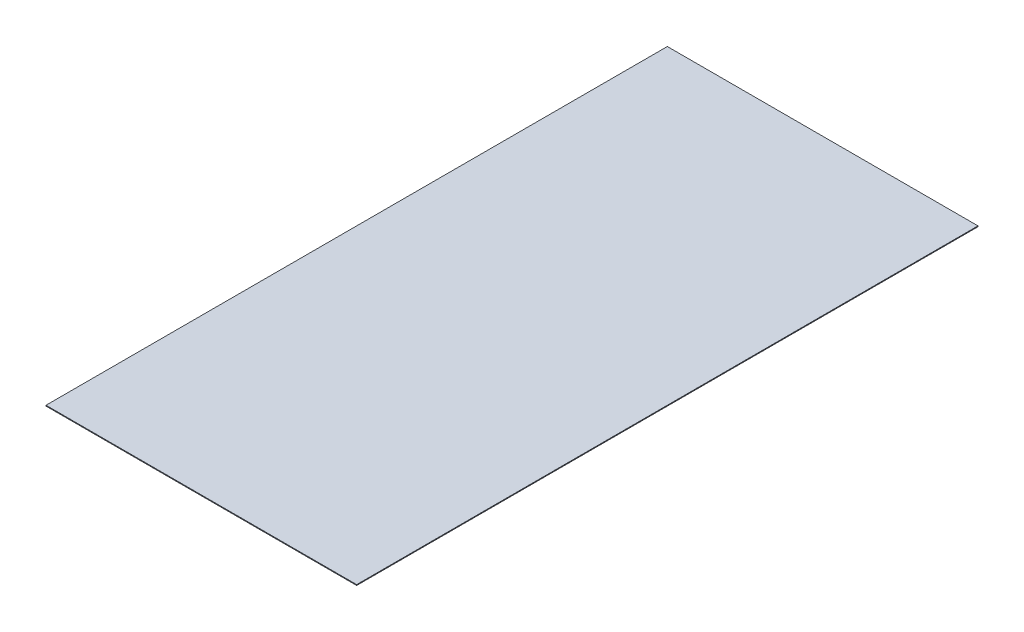
ISO-10303-21;
HEADER;
FILE_DESCRIPTION(('STEP AP214'),'2;1');
FILE_NAME('part.step','',(''),(''),'','','');
FILE_SCHEMA(('AUTOMOTIVE_DESIGN { 1 0 10303 214 1 1 1 1 }'));
ENDSEC;
DATA;
#1=APPLICATION_CONTEXT('core data for automotive mechanical design processes');
#2=APPLICATION_PROTOCOL_DEFINITION('international standard','automotive_design',2000,#1);
#3=PRODUCT_CONTEXT('',#1,'mechanical');
#4=PRODUCT('Part','Part','',(#3));
#5=PRODUCT_RELATED_PRODUCT_CATEGORY('part','',(#4));
#6=PRODUCT_DEFINITION_FORMATION('','',#4);
#7=PRODUCT_DEFINITION_CONTEXT('part definition',#1,'design');
#8=PRODUCT_DEFINITION('design','',#6,#7);
#9=PRODUCT_DEFINITION_SHAPE('','',#8);
#10=(LENGTH_UNIT() NAMED_UNIT(*) SI_UNIT(.MILLI.,.METRE.));
#11=(NAMED_UNIT(*) PLANE_ANGLE_UNIT() SI_UNIT($,.RADIAN.));
#12=(NAMED_UNIT(*) SI_UNIT($,.STERADIAN.) SOLID_ANGLE_UNIT());
#13=UNCERTAINTY_MEASURE_WITH_UNIT(LENGTH_MEASURE(1.E-05),#10,'distance_accuracy_value','');
#14=(GEOMETRIC_REPRESENTATION_CONTEXT(3) GLOBAL_UNCERTAINTY_ASSIGNED_CONTEXT((#13)) GLOBAL_UNIT_ASSIGNED_CONTEXT((#10,
#11,#12)) REPRESENTATION_CONTEXT('',''));
#15=CARTESIAN_POINT('',(0.,0.,0.));
#16=DIRECTION('',(0.,0.,1.));
#17=DIRECTION('',(1.,0.,0.));
#18=AXIS2_PLACEMENT_3D('',#15,#16,#17);
#19=CARTESIAN_POINT('',(0.,1.,0.));
#20=DIRECTION('',(1.,0.,0.));
#21=DIRECTION('',(0.,0.,-1.));
#22=AXIS2_PLACEMENT_3D('',#19,#20,#21);
#23=PLANE('',#22);
#24=DIRECTION('',(0.,0.,1.));
#25=VECTOR('',#24,1.);
#26=CARTESIAN_POINT('',(0.,0.,0.));
#27=LINE('',#26,#25);
#28=CARTESIAN_POINT('',(0.,0.,-800.));
#29=VERTEX_POINT('',#28);
#30=CARTESIAN_POINT('',(0.,0.,0.));
#31=VERTEX_POINT('',#30);
#32=EDGE_CURVE('E109',#29,#31,#27,.T.);
#33=ORIENTED_EDGE('',*,*,#32,.T.);
#34=DIRECTION('',(0.,-1.,0.));
#35=VECTOR('',#34,1.);
#36=CARTESIAN_POINT('',(0.,1.,0.));
#37=LINE('',#36,#35);
#38=CARTESIAN_POINT('',(0.,1.,0.));
#39=VERTEX_POINT('',#38);
#40=EDGE_CURVE('E11',#39,#31,#37,.T.);
#41=ORIENTED_EDGE('',*,*,#40,.F.);
#42=DIRECTION('',(0.,0.,1.));
#43=VECTOR('',#42,1.);
#44=CARTESIAN_POINT('',(0.,1.,0.));
#45=LINE('',#44,#43);
#46=CARTESIAN_POINT('',(0.,1.,-800.));
#47=VERTEX_POINT('',#46);
#48=EDGE_CURVE('E93',#47,#39,#45,.T.);
#49=ORIENTED_EDGE('',*,*,#48,.F.);
#50=DIRECTION('',(0.,-1.,0.));
#51=VECTOR('',#50,1.);
#52=CARTESIAN_POINT('',(0.,1.,-800.));
#53=LINE('',#52,#51);
#54=EDGE_CURVE('E105',#47,#29,#53,.T.);
#55=ORIENTED_EDGE('',*,*,#54,.T.);
#56=EDGE_LOOP('',(#33,#41,#49,#55));
#57=FACE_BOUND('',#56,.T.);
#58=ADVANCED_FACE('F41',(#57),#23,.F.);
#59=CARTESIAN_POINT('',(0.,1.,0.));
#60=DIRECTION('',(0.,0.,-1.));
#61=DIRECTION('',(-1.,0.,0.));
#62=AXIS2_PLACEMENT_3D('',#59,#60,#61);
#63=PLANE('',#62);
#64=DIRECTION('',(1.,0.,0.));
#65=VECTOR('',#64,1.);
#66=CARTESIAN_POINT('',(0.,0.,0.));
#67=LINE('',#66,#65);
#68=CARTESIAN_POINT('',(400.,0.,0.));
#69=VERTEX_POINT('',#68);
#70=EDGE_CURVE('E98',#31,#69,#67,.T.);
#71=ORIENTED_EDGE('',*,*,#70,.T.);
#72=DIRECTION('',(0.,-1.,0.));
#73=VECTOR('',#72,1.);
#74=CARTESIAN_POINT('',(400.,1.,0.));
#75=LINE('',#74,#73);
#76=CARTESIAN_POINT('',(400.,1.,0.));
#77=VERTEX_POINT('',#76);
#78=EDGE_CURVE('E50',#77,#69,#75,.T.);
#79=ORIENTED_EDGE('',*,*,#78,.F.);
#80=DIRECTION('',(1.,0.,0.));
#81=VECTOR('',#80,1.);
#82=CARTESIAN_POINT('',(0.,1.,0.));
#83=LINE('',#82,#81);
#84=EDGE_CURVE('E88',#39,#77,#83,.T.);
#85=ORIENTED_EDGE('',*,*,#84,.F.);
#86=ORIENTED_EDGE('',*,*,#40,.T.);
#87=EDGE_LOOP('',(#71,#79,#85,#86));
#88=FACE_BOUND('',#87,.T.);
#89=ADVANCED_FACE('F97',(#88),#63,.F.);
#90=CARTESIAN_POINT('',(400.,1.,0.));
#91=DIRECTION('',(-1.,0.,0.));
#92=DIRECTION('',(0.,0.,1.));
#93=AXIS2_PLACEMENT_3D('',#90,#91,#92);
#94=PLANE('',#93);
#95=DIRECTION('',(0.,0.,-1.));
#96=VECTOR('',#95,1.);
#97=CARTESIAN_POINT('',(400.,0.,0.));
#98=LINE('',#97,#96);
#99=CARTESIAN_POINT('',(400.,0.,-800.));
#100=VERTEX_POINT('',#99);
#101=EDGE_CURVE('E75',#69,#100,#98,.T.);
#102=ORIENTED_EDGE('',*,*,#101,.T.);
#103=DIRECTION('',(0.,-1.,0.));
#104=VECTOR('',#103,1.);
#105=CARTESIAN_POINT('',(400.,1.,-800.));
#106=LINE('',#105,#104);
#107=CARTESIAN_POINT('',(400.,1.,-800.));
#108=VERTEX_POINT('',#107);
#109=EDGE_CURVE('E100',#108,#100,#106,.T.);
#110=ORIENTED_EDGE('',*,*,#109,.F.);
#111=DIRECTION('',(0.,0.,-1.));
#112=VECTOR('',#111,1.);
#113=CARTESIAN_POINT('',(400.,1.,0.));
#114=LINE('',#113,#112);
#115=EDGE_CURVE('E91',#77,#108,#114,.T.);
#116=ORIENTED_EDGE('',*,*,#115,.F.);
#117=ORIENTED_EDGE('',*,*,#78,.T.);
#118=EDGE_LOOP('',(#102,#110,#116,#117));
#119=FACE_BOUND('',#118,.T.);
#120=ADVANCED_FACE('F101',(#119),#94,.F.);
#121=CARTESIAN_POINT('',(0.,1.,-800.));
#122=DIRECTION('',(0.,0.,1.));
#123=DIRECTION('',(1.,0.,0.));
#124=AXIS2_PLACEMENT_3D('',#121,#122,#123);
#125=PLANE('',#124);
#126=DIRECTION('',(-1.,0.,0.));
#127=VECTOR('',#126,1.);
#128=CARTESIAN_POINT('',(0.,0.,-800.));
#129=LINE('',#128,#127);
#130=EDGE_CURVE('E81',#100,#29,#129,.T.);
#131=ORIENTED_EDGE('',*,*,#130,.T.);
#132=ORIENTED_EDGE('',*,*,#54,.F.);
#133=DIRECTION('',(-1.,0.,0.));
#134=VECTOR('',#133,1.);
#135=CARTESIAN_POINT('',(0.,1.,-800.));
#136=LINE('',#135,#134);
#137=EDGE_CURVE('E58',#108,#47,#136,.T.);
#138=ORIENTED_EDGE('',*,*,#137,.F.);
#139=ORIENTED_EDGE('',*,*,#109,.T.);
#140=EDGE_LOOP('',(#131,#132,#138,#139));
#141=FACE_BOUND('',#140,.T.);
#142=ADVANCED_FACE('F122',(#141),#125,.F.);
#143=CARTESIAN_POINT('',(0.,1.,0.));
#144=DIRECTION('',(0.,-1.,0.));
#145=DIRECTION('',(0.,0.,-1.));
#146=AXIS2_PLACEMENT_3D('',#143,#144,#145);
#147=PLANE('',#146);
#148=ORIENTED_EDGE('',*,*,#48,.T.);
#149=ORIENTED_EDGE('',*,*,#84,.T.);
#150=ORIENTED_EDGE('',*,*,#115,.T.);
#151=ORIENTED_EDGE('',*,*,#137,.T.);
#152=EDGE_LOOP('',(#148,#149,#150,#151));
#153=FACE_BOUND('',#152,.T.);
#154=ADVANCED_FACE('F89',(#153),#147,.F.);
#155=CARTESIAN_POINT('',(0.,0.,0.));
#156=DIRECTION('',(0.,-1.,0.));
#157=DIRECTION('',(0.,0.,-1.));
#158=AXIS2_PLACEMENT_3D('',#155,#156,#157);
#159=PLANE('',#158);
#160=ORIENTED_EDGE('',*,*,#32,.F.);
#161=ORIENTED_EDGE('',*,*,#130,.F.);
#162=ORIENTED_EDGE('',*,*,#101,.F.);
#163=ORIENTED_EDGE('',*,*,#70,.F.);
#164=EDGE_LOOP('',(#160,#161,#162,#163));
#165=FACE_BOUND('',#164,.T.);
#166=ADVANCED_FACE('F125',(#165),#159,.T.);
#167=CLOSED_SHELL('',(#58,#89,#120,#142,#154,#166));
#168=MANIFOLD_SOLID_BREP('B2',#167);
#169=ADVANCED_BREP_SHAPE_REPRESENTATION('',(#18,#168),#14);
#170=SHAPE_DEFINITION_REPRESENTATION(#9,#169);
ENDSEC;
END-ISO-10303-21;
